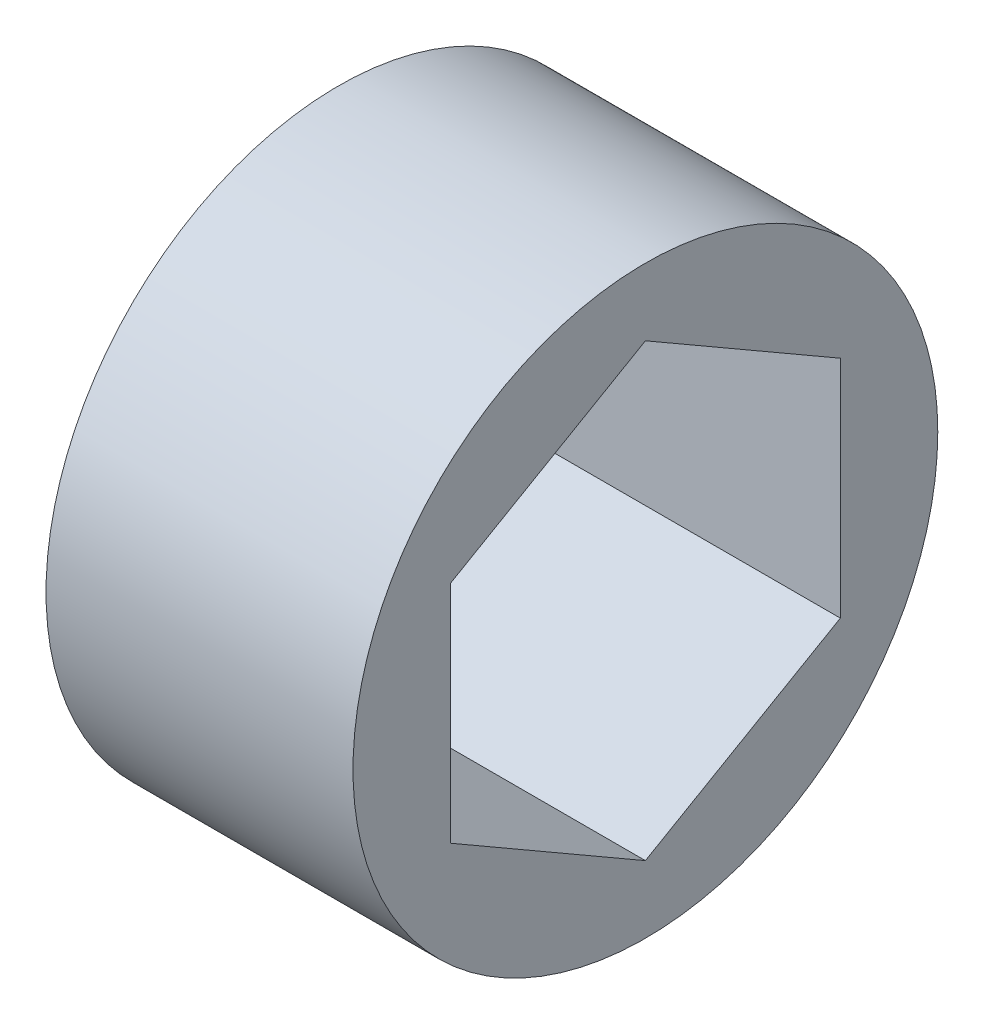
ISO-10303-21;
HEADER;
FILE_DESCRIPTION(('STEP AP214'),'2;1');
FILE_NAME('part.step','',(''),(''),'','','');
FILE_SCHEMA(('AUTOMOTIVE_DESIGN { 1 0 10303 214 1 1 1 1 }'));
ENDSEC;
DATA;
#1=APPLICATION_CONTEXT('core data for automotive mechanical design processes');
#2=APPLICATION_PROTOCOL_DEFINITION('international standard','automotive_design',2000,#1);
#3=PRODUCT_CONTEXT('',#1,'mechanical');
#4=PRODUCT('Part','Part','',(#3));
#5=PRODUCT_RELATED_PRODUCT_CATEGORY('part','',(#4));
#6=PRODUCT_DEFINITION_FORMATION('','',#4);
#7=PRODUCT_DEFINITION_CONTEXT('part definition',#1,'design');
#8=PRODUCT_DEFINITION('design','',#6,#7);
#9=PRODUCT_DEFINITION_SHAPE('','',#8);
#10=(LENGTH_UNIT() NAMED_UNIT(*) SI_UNIT(.MILLI.,.METRE.));
#11=(NAMED_UNIT(*) PLANE_ANGLE_UNIT() SI_UNIT($,.RADIAN.));
#12=(NAMED_UNIT(*) SI_UNIT($,.STERADIAN.) SOLID_ANGLE_UNIT());
#13=UNCERTAINTY_MEASURE_WITH_UNIT(LENGTH_MEASURE(1.E-05),#10,'distance_accuracy_value','');
#14=(GEOMETRIC_REPRESENTATION_CONTEXT(3) GLOBAL_UNCERTAINTY_ASSIGNED_CONTEXT((#13)) GLOBAL_UNIT_ASSIGNED_CONTEXT((#10,
#11,#12)) REPRESENTATION_CONTEXT('',''));
#15=CARTESIAN_POINT('',(0.,0.,0.));
#16=DIRECTION('',(0.,0.,1.));
#17=DIRECTION('',(1.,0.,0.));
#18=AXIS2_PLACEMENT_3D('',#15,#16,#17);
#19=CARTESIAN_POINT('',(10.,0.,0.));
#20=DIRECTION('',(1.,0.,0.));
#21=DIRECTION('',(0.,0.,-1.));
#22=AXIS2_PLACEMENT_3D('',#19,#20,#21);
#23=PLANE('',#22);
#24=CARTESIAN_POINT('',(10.,0.,0.));
#25=DIRECTION('',(1.,0.,0.));
#26=DIRECTION('',(0.,0.,-1.));
#27=AXIS2_PLACEMENT_3D('',#24,#25,#26);
#28=CIRCLE('',#27,9.525);
#29=CARTESIAN_POINT('',(10.,0.,-9.525));
#30=VERTEX_POINT('',#29);
#31=EDGE_CURVE('E11',#30,#30,#28,.T.);
#32=ORIENTED_EDGE('',*,*,#31,.T.);
#33=EDGE_LOOP('',(#32));
#34=FACE_BOUND('',#33,.T.);
#35=DIRECTION('',(0.,-0.500000000000001,0.866025403784438));
#36=VECTOR('',#35,1.);
#37=CARTESIAN_POINT('',(10.,7.33234841870825,0.));
#38=LINE('',#37,#36);
#39=CARTESIAN_POINT('',(10.,7.33234841870825,0.));
#40=VERTEX_POINT('',#39);
#41=CARTESIAN_POINT('',(10.,3.66617420935411,6.35000000000001));
#42=VERTEX_POINT('',#41);
#43=EDGE_CURVE('E93',#40,#42,#38,.T.);
#44=ORIENTED_EDGE('',*,*,#43,.F.);
#45=DIRECTION('',(0.,0.499999999999995,0.866025403784441));
#46=VECTOR('',#45,1.);
#47=CARTESIAN_POINT('',(10.,3.6661742093542,-6.34999999999996));
#48=LINE('',#47,#46);
#49=CARTESIAN_POINT('',(10.,3.6661742093542,-6.34999999999996));
#50=VERTEX_POINT('',#49);
#51=EDGE_CURVE('E85',#50,#40,#48,.T.);
#52=ORIENTED_EDGE('',*,*,#51,.F.);
#53=DIRECTION('',(0.,1.,0.));
#54=VECTOR('',#53,1.);
#55=CARTESIAN_POINT('',(10.,-3.66617420935407,-6.35000000000004));
#56=LINE('',#55,#54);
#57=CARTESIAN_POINT('',(10.,-3.66617420935407,-6.35000000000004));
#58=VERTEX_POINT('',#57);
#59=EDGE_CURVE('E113',#58,#50,#56,.T.);
#60=ORIENTED_EDGE('',*,*,#59,.F.);
#61=DIRECTION('',(0.,0.500000000000007,-0.866025403784435));
#62=VECTOR('',#61,1.);
#63=CARTESIAN_POINT('',(10.,-7.33234841870825,0.));
#64=LINE('',#63,#62);
#65=CARTESIAN_POINT('',(10.,-7.33234841870825,0.));
#66=VERTEX_POINT('',#65);
#67=EDGE_CURVE('E111',#66,#58,#64,.T.);
#68=ORIENTED_EDGE('',*,*,#67,.F.);
#69=DIRECTION('',(0.,-0.499999999999995,-0.866025403784442));
#70=VECTOR('',#69,1.);
#71=CARTESIAN_POINT('',(10.,-3.66617420935416,6.34999999999999));
#72=LINE('',#71,#70);
#73=CARTESIAN_POINT('',(10.,-3.66617420935416,6.34999999999999));
#74=VERTEX_POINT('',#73);
#75=EDGE_CURVE('E107',#74,#66,#72,.T.);
#76=ORIENTED_EDGE('',*,*,#75,.F.);
#77=DIRECTION('',(0.,-1.,0.));
#78=VECTOR('',#77,1.);
#79=CARTESIAN_POINT('',(10.,3.66617420935411,6.35000000000001));
#80=LINE('',#79,#78);
#81=EDGE_CURVE('E105',#42,#74,#80,.T.);
#82=ORIENTED_EDGE('',*,*,#81,.F.);
#83=EDGE_LOOP('',(#44,#52,#60,#68,#76,#82));
#84=FACE_BOUND('',#83,.T.);
#85=ADVANCED_FACE('F32',(#34,#84),#23,.T.);
#86=CARTESIAN_POINT('',(0.,0.,0.));
#87=DIRECTION('',(1.,0.,0.));
#88=DIRECTION('',(0.,0.,-1.));
#89=AXIS2_PLACEMENT_3D('',#86,#87,#88);
#90=PLANE('',#89);
#91=CARTESIAN_POINT('',(0.,0.,0.));
#92=DIRECTION('',(1.,0.,0.));
#93=DIRECTION('',(0.,0.,-1.));
#94=AXIS2_PLACEMENT_3D('',#91,#92,#93);
#95=CIRCLE('',#94,9.525);
#96=CARTESIAN_POINT('',(0.,0.,-9.525));
#97=VERTEX_POINT('',#96);
#98=EDGE_CURVE('E36',#97,#97,#95,.T.);
#99=ORIENTED_EDGE('',*,*,#98,.F.);
#100=EDGE_LOOP('',(#99));
#101=FACE_BOUND('',#100,.T.);
#102=DIRECTION('',(0.,0.499999999999995,0.866025403784441));
#103=VECTOR('',#102,1.);
#104=CARTESIAN_POINT('',(0.,3.6661742093542,-6.34999999999996));
#105=LINE('',#104,#103);
#106=CARTESIAN_POINT('',(0.,3.6661742093542,-6.34999999999996));
#107=VERTEX_POINT('',#106);
#108=CARTESIAN_POINT('',(0.,7.33234841870825,0.));
#109=VERTEX_POINT('',#108);
#110=EDGE_CURVE('E55',#107,#109,#105,.T.);
#111=ORIENTED_EDGE('',*,*,#110,.T.);
#112=DIRECTION('',(0.,-0.500000000000001,0.866025403784438));
#113=VECTOR('',#112,1.);
#114=CARTESIAN_POINT('',(0.,7.33234841870825,0.));
#115=LINE('',#114,#113);
#116=CARTESIAN_POINT('',(0.,3.66617420935411,6.35000000000001));
#117=VERTEX_POINT('',#116);
#118=EDGE_CURVE('E100',#109,#117,#115,.T.);
#119=ORIENTED_EDGE('',*,*,#118,.T.);
#120=DIRECTION('',(0.,-1.,0.));
#121=VECTOR('',#120,1.);
#122=CARTESIAN_POINT('',(0.,3.66617420935411,6.35000000000001));
#123=LINE('',#122,#121);
#124=CARTESIAN_POINT('',(0.,-3.66617420935416,6.34999999999999));
#125=VERTEX_POINT('',#124);
#126=EDGE_CURVE('E117',#117,#125,#123,.T.);
#127=ORIENTED_EDGE('',*,*,#126,.T.);
#128=DIRECTION('',(0.,-0.499999999999995,-0.866025403784442));
#129=VECTOR('',#128,1.);
#130=CARTESIAN_POINT('',(0.,-3.66617420935416,6.34999999999999));
#131=LINE('',#130,#129);
#132=CARTESIAN_POINT('',(0.,-7.33234841870825,0.));
#133=VERTEX_POINT('',#132);
#134=EDGE_CURVE('E120',#125,#133,#131,.T.);
#135=ORIENTED_EDGE('',*,*,#134,.T.);
#136=DIRECTION('',(0.,0.500000000000007,-0.866025403784435));
#137=VECTOR('',#136,1.);
#138=CARTESIAN_POINT('',(0.,-7.33234841870825,0.));
#139=LINE('',#138,#137);
#140=CARTESIAN_POINT('',(0.,-3.66617420935407,-6.35000000000004));
#141=VERTEX_POINT('',#140);
#142=EDGE_CURVE('E123',#133,#141,#139,.T.);
#143=ORIENTED_EDGE('',*,*,#142,.T.);
#144=DIRECTION('',(0.,1.,0.));
#145=VECTOR('',#144,1.);
#146=CARTESIAN_POINT('',(0.,-3.66617420935407,-6.35000000000004));
#147=LINE('',#146,#145);
#148=EDGE_CURVE('E94',#141,#107,#147,.T.);
#149=ORIENTED_EDGE('',*,*,#148,.T.);
#150=EDGE_LOOP('',(#111,#119,#127,#135,#143,#149));
#151=FACE_BOUND('',#150,.T.);
#152=ADVANCED_FACE('F140',(#101,#151),#90,.F.);
#153=CARTESIAN_POINT('',(10.,0.,0.));
#154=DIRECTION('',(-1.,0.,0.));
#155=DIRECTION('',(0.,0.,1.));
#156=AXIS2_PLACEMENT_3D('',#153,#154,#155);
#157=CYLINDRICAL_SURFACE('',#156,9.525);
#158=ORIENTED_EDGE('',*,*,#31,.F.);
#159=EDGE_LOOP('',(#158));
#160=FACE_BOUND('',#159,.T.);
#161=ORIENTED_EDGE('',*,*,#98,.T.);
#162=EDGE_LOOP('',(#161));
#163=FACE_BOUND('',#162,.T.);
#164=ADVANCED_FACE('F34',(#160,#163),#157,.T.);
#165=CARTESIAN_POINT('',(10.,3.6661742093542,-6.34999999999996));
#166=DIRECTION('',(0.,-0.866025403784442,0.499999999999995));
#167=DIRECTION('',(0.,-0.499999999999995,-0.866025403784442));
#168=AXIS2_PLACEMENT_3D('',#165,#166,#167);
#169=PLANE('',#168);
#170=ORIENTED_EDGE('',*,*,#110,.F.);
#171=DIRECTION('',(-1.,0.,0.));
#172=VECTOR('',#171,1.);
#173=CARTESIAN_POINT('',(10.,3.6661742093542,-6.34999999999996));
#174=LINE('',#173,#172);
#175=EDGE_CURVE('E89',#50,#107,#174,.T.);
#176=ORIENTED_EDGE('',*,*,#175,.F.);
#177=ORIENTED_EDGE('',*,*,#51,.T.);
#178=DIRECTION('',(-1.,0.,0.));
#179=VECTOR('',#178,1.);
#180=CARTESIAN_POINT('',(10.,7.33234841870825,0.));
#181=LINE('',#180,#179);
#182=EDGE_CURVE('E88',#40,#109,#181,.T.);
#183=ORIENTED_EDGE('',*,*,#182,.T.);
#184=EDGE_LOOP('',(#170,#176,#177,#183));
#185=FACE_BOUND('',#184,.T.);
#186=ADVANCED_FACE('F87',(#185),#169,.T.);
#187=CARTESIAN_POINT('',(10.,7.33234841870825,0.));
#188=DIRECTION('',(0.,-0.866025403784438,-0.500000000000001));
#189=DIRECTION('',(0.,0.500000000000001,-0.866025403784438));
#190=AXIS2_PLACEMENT_3D('',#187,#188,#189);
#191=PLANE('',#190);
#192=ORIENTED_EDGE('',*,*,#118,.F.);
#193=ORIENTED_EDGE('',*,*,#182,.F.);
#194=ORIENTED_EDGE('',*,*,#43,.T.);
#195=DIRECTION('',(-1.,0.,0.));
#196=VECTOR('',#195,1.);
#197=CARTESIAN_POINT('',(10.,3.66617420935411,6.35000000000001));
#198=LINE('',#197,#196);
#199=EDGE_CURVE('E101',#42,#117,#198,.T.);
#200=ORIENTED_EDGE('',*,*,#199,.T.);
#201=EDGE_LOOP('',(#192,#193,#194,#200));
#202=FACE_BOUND('',#201,.T.);
#203=ADVANCED_FACE('F97',(#202),#191,.T.);
#204=CARTESIAN_POINT('',(10.,3.66617420935411,6.35000000000001));
#205=DIRECTION('',(0.,0.,-1.));
#206=DIRECTION('',(0.,1.,0.));
#207=AXIS2_PLACEMENT_3D('',#204,#205,#206);
#208=PLANE('',#207);
#209=ORIENTED_EDGE('',*,*,#126,.F.);
#210=ORIENTED_EDGE('',*,*,#199,.F.);
#211=ORIENTED_EDGE('',*,*,#81,.T.);
#212=DIRECTION('',(-1.,0.,0.));
#213=VECTOR('',#212,1.);
#214=CARTESIAN_POINT('',(10.,-3.66617420935416,6.34999999999999));
#215=LINE('',#214,#213);
#216=EDGE_CURVE('E132',#74,#125,#215,.T.);
#217=ORIENTED_EDGE('',*,*,#216,.T.);
#218=EDGE_LOOP('',(#209,#210,#211,#217));
#219=FACE_BOUND('',#218,.T.);
#220=ADVANCED_FACE('F136',(#219),#208,.T.);
#221=CARTESIAN_POINT('',(10.,-3.66617420935416,6.34999999999999));
#222=DIRECTION('',(0.,0.866025403784442,-0.499999999999995));
#223=DIRECTION('',(0.,0.499999999999995,0.866025403784442));
#224=AXIS2_PLACEMENT_3D('',#221,#222,#223);
#225=PLANE('',#224);
#226=ORIENTED_EDGE('',*,*,#134,.F.);
#227=ORIENTED_EDGE('',*,*,#216,.F.);
#228=ORIENTED_EDGE('',*,*,#75,.T.);
#229=DIRECTION('',(-1.,0.,0.));
#230=VECTOR('',#229,1.);
#231=CARTESIAN_POINT('',(10.,-7.33234841870825,0.));
#232=LINE('',#231,#230);
#233=EDGE_CURVE('E130',#66,#133,#232,.T.);
#234=ORIENTED_EDGE('',*,*,#233,.T.);
#235=EDGE_LOOP('',(#226,#227,#228,#234));
#236=FACE_BOUND('',#235,.T.);
#237=ADVANCED_FACE('F148',(#236),#225,.T.);
#238=CARTESIAN_POINT('',(10.,-7.33234841870825,0.));
#239=DIRECTION('',(0.,0.866025403784435,0.500000000000007));
#240=DIRECTION('',(0.,-0.500000000000007,0.866025403784435));
#241=AXIS2_PLACEMENT_3D('',#238,#239,#240);
#242=PLANE('',#241);
#243=ORIENTED_EDGE('',*,*,#142,.F.);
#244=ORIENTED_EDGE('',*,*,#233,.F.);
#245=ORIENTED_EDGE('',*,*,#67,.T.);
#246=DIRECTION('',(-1.,0.,0.));
#247=VECTOR('',#246,1.);
#248=CARTESIAN_POINT('',(10.,-3.66617420935407,-6.35000000000004));
#249=LINE('',#248,#247);
#250=EDGE_CURVE('E47',#58,#141,#249,.T.);
#251=ORIENTED_EDGE('',*,*,#250,.T.);
#252=EDGE_LOOP('',(#243,#244,#245,#251));
#253=FACE_BOUND('',#252,.T.);
#254=ADVANCED_FACE('F146',(#253),#242,.T.);
#255=CARTESIAN_POINT('',(10.,-3.66617420935407,-6.35000000000004));
#256=DIRECTION('',(0.,0.,1.));
#257=DIRECTION('',(0.,-1.,0.));
#258=AXIS2_PLACEMENT_3D('',#255,#256,#257);
#259=PLANE('',#258);
#260=ORIENTED_EDGE('',*,*,#148,.F.);
#261=ORIENTED_EDGE('',*,*,#250,.F.);
#262=ORIENTED_EDGE('',*,*,#59,.T.);
#263=ORIENTED_EDGE('',*,*,#175,.T.);
#264=EDGE_LOOP('',(#260,#261,#262,#263));
#265=FACE_BOUND('',#264,.T.);
#266=ADVANCED_FACE('F142',(#265),#259,.T.);
#267=CLOSED_SHELL('',(#85,#152,#164,#186,#203,#220,#237,#254,#266));
#268=MANIFOLD_SOLID_BREP('B2',#267);
#269=ADVANCED_BREP_SHAPE_REPRESENTATION('',(#18,#268),#14);
#270=SHAPE_DEFINITION_REPRESENTATION(#9,#269);
ENDSEC;
END-ISO-10303-21;
